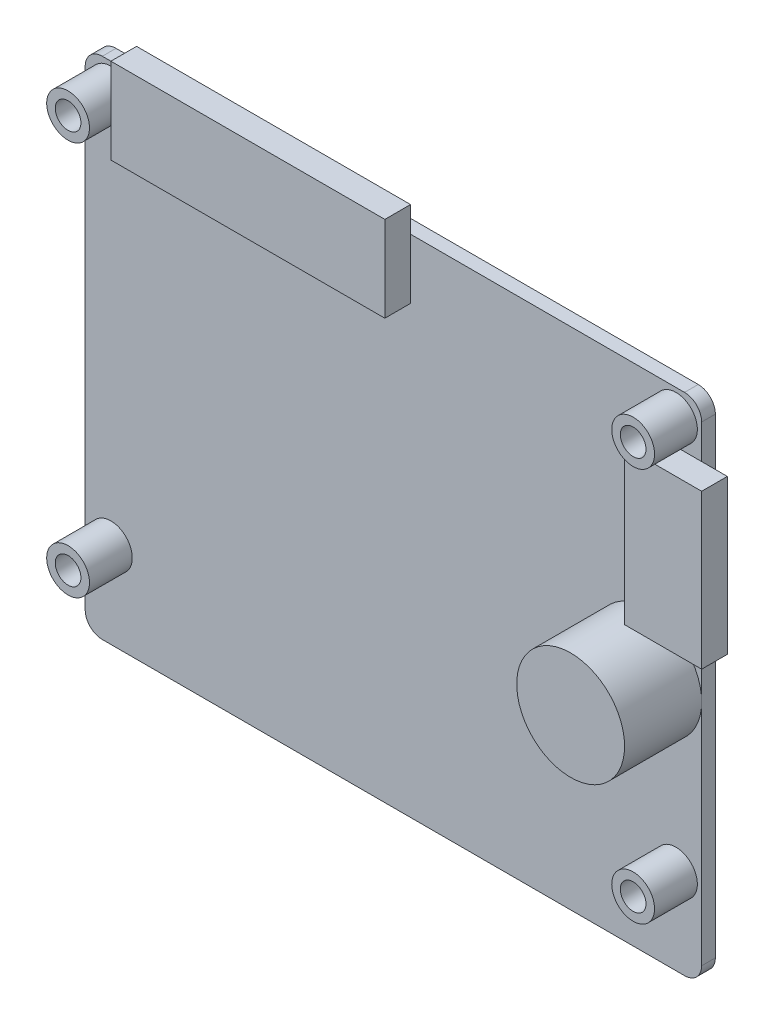
ISO-10303-21;
HEADER;
FILE_DESCRIPTION(('STEP AP214'),'2;1');
FILE_NAME('part.step','',(''),(''),'','','');
FILE_SCHEMA(('AUTOMOTIVE_DESIGN { 1 0 10303 214 1 1 1 1 }'));
ENDSEC;
DATA;
#1=APPLICATION_CONTEXT('core data for automotive mechanical design processes');
#2=APPLICATION_PROTOCOL_DEFINITION('international standard','automotive_design',2000,#1);
#3=PRODUCT_CONTEXT('',#1,'mechanical');
#4=PRODUCT('Part','Part','',(#3));
#5=PRODUCT_RELATED_PRODUCT_CATEGORY('part','',(#4));
#6=PRODUCT_DEFINITION_FORMATION('','',#4);
#7=PRODUCT_DEFINITION_CONTEXT('part definition',#1,'design');
#8=PRODUCT_DEFINITION('design','',#6,#7);
#9=PRODUCT_DEFINITION_SHAPE('','',#8);
#10=(LENGTH_UNIT() NAMED_UNIT(*) SI_UNIT(.MILLI.,.METRE.));
#11=(NAMED_UNIT(*) PLANE_ANGLE_UNIT() SI_UNIT($,.RADIAN.));
#12=(NAMED_UNIT(*) SI_UNIT($,.STERADIAN.) SOLID_ANGLE_UNIT());
#13=UNCERTAINTY_MEASURE_WITH_UNIT(LENGTH_MEASURE(1.E-05),#10,'distance_accuracy_value','');
#14=(GEOMETRIC_REPRESENTATION_CONTEXT(3) GLOBAL_UNCERTAINTY_ASSIGNED_CONTEXT((#13)) GLOBAL_UNIT_ASSIGNED_CONTEXT((#10,
#11,#12)) REPRESENTATION_CONTEXT('',''));
#15=CARTESIAN_POINT('',(0.,0.,0.));
#16=DIRECTION('',(0.,0.,1.));
#17=DIRECTION('',(1.,0.,0.));
#18=AXIS2_PLACEMENT_3D('',#15,#16,#17);
#19=CARTESIAN_POINT('',(-34.,27.5,0.));
#20=DIRECTION('',(0.,0.,-1.));
#21=DIRECTION('',(-1.,0.,0.));
#22=AXIS2_PLACEMENT_3D('',#19,#20,#21);
#23=PLANE('',#22);
#24=CARTESIAN_POINT('',(33.,-19.5,0.));
#25=DIRECTION('',(0.,0.,1.));
#26=DIRECTION('',(1.,0.,0.));
#27=AXIS2_PLACEMENT_3D('',#24,#25,#26);
#28=CIRCLE('',#27,1.5);
#29=CARTESIAN_POINT('',(34.5,-19.5,0.));
#30=VERTEX_POINT('',#29);
#31=EDGE_CURVE('E329',#30,#30,#28,.T.);
#32=ORIENTED_EDGE('',*,*,#31,.T.);
#33=EDGE_LOOP('',(#32));
#34=FACE_BOUND('',#33,.T.);
#35=CARTESIAN_POINT('',(-33.,26.5,0.));
#36=DIRECTION('',(0.,0.,1.));
#37=DIRECTION('',(1.,0.,0.));
#38=AXIS2_PLACEMENT_3D('',#35,#36,#37);
#39=CIRCLE('',#38,1.5);
#40=CARTESIAN_POINT('',(-31.5,26.5,0.));
#41=VERTEX_POINT('',#40);
#42=EDGE_CURVE('E335',#41,#41,#39,.T.);
#43=ORIENTED_EDGE('',*,*,#42,.T.);
#44=EDGE_LOOP('',(#43));
#45=FACE_BOUND('',#44,.T.);
#46=CARTESIAN_POINT('',(-34.,27.5,0.));
#47=DIRECTION('',(0.,0.,1.));
#48=DIRECTION('',(-1.,0.,0.));
#49=AXIS2_PLACEMENT_3D('',#46,#47,#48);
#50=CIRCLE('',#49,2.);
#51=CARTESIAN_POINT('',(-34.,29.5,0.));
#52=VERTEX_POINT('',#51);
#53=CARTESIAN_POINT('',(-36.,27.5,0.));
#54=VERTEX_POINT('',#53);
#55=EDGE_CURVE('E338',#52,#54,#50,.T.);
#56=ORIENTED_EDGE('',*,*,#55,.F.);
#57=DIRECTION('',(-1.,0.,0.));
#58=VECTOR('',#57,1.);
#59=CARTESIAN_POINT('',(-34.,29.5,0.));
#60=LINE('',#59,#58);
#61=CARTESIAN_POINT('',(34.,29.5,0.));
#62=VERTEX_POINT('',#61);
#63=EDGE_CURVE('E343',#62,#52,#60,.T.);
#64=ORIENTED_EDGE('',*,*,#63,.F.);
#65=CARTESIAN_POINT('',(34.,27.5,0.));
#66=DIRECTION('',(0.,0.,1.));
#67=DIRECTION('',(-1.,0.,0.));
#68=AXIS2_PLACEMENT_3D('',#65,#66,#67);
#69=CIRCLE('',#68,2.);
#70=CARTESIAN_POINT('',(36.,27.5,0.));
#71=VERTEX_POINT('',#70);
#72=EDGE_CURVE('E375',#71,#62,#69,.T.);
#73=ORIENTED_EDGE('',*,*,#72,.F.);
#74=DIRECTION('',(0.,1.,0.));
#75=VECTOR('',#74,1.);
#76=CARTESIAN_POINT('',(36.,-27.5,0.));
#77=LINE('',#76,#75);
#78=CARTESIAN_POINT('',(36.,-27.5,0.));
#79=VERTEX_POINT('',#78);
#80=EDGE_CURVE('E373',#79,#71,#77,.T.);
#81=ORIENTED_EDGE('',*,*,#80,.F.);
#82=CARTESIAN_POINT('',(34.,-27.5,0.));
#83=DIRECTION('',(0.,0.,1.));
#84=DIRECTION('',(1.,0.,0.));
#85=AXIS2_PLACEMENT_3D('',#82,#83,#84);
#86=CIRCLE('',#85,2.);
#87=CARTESIAN_POINT('',(34.,-29.5,0.));
#88=VERTEX_POINT('',#87);
#89=EDGE_CURVE('E371',#88,#79,#86,.T.);
#90=ORIENTED_EDGE('',*,*,#89,.F.);
#91=DIRECTION('',(1.,0.,0.));
#92=VECTOR('',#91,1.);
#93=CARTESIAN_POINT('',(-34.,-29.5,0.));
#94=LINE('',#93,#92);
#95=CARTESIAN_POINT('',(-34.,-29.5,0.));
#96=VERTEX_POINT('',#95);
#97=EDGE_CURVE('E369',#96,#88,#94,.T.);
#98=ORIENTED_EDGE('',*,*,#97,.F.);
#99=CARTESIAN_POINT('',(-34.,-27.5,0.));
#100=DIRECTION('',(0.,0.,1.));
#101=DIRECTION('',(-1.,0.,0.));
#102=AXIS2_PLACEMENT_3D('',#99,#100,#101);
#103=CIRCLE('',#102,2.);
#104=CARTESIAN_POINT('',(-36.,-27.5,0.));
#105=VERTEX_POINT('',#104);
#106=EDGE_CURVE('E367',#105,#96,#103,.T.);
#107=ORIENTED_EDGE('',*,*,#106,.F.);
#108=DIRECTION('',(0.,-1.,0.));
#109=VECTOR('',#108,1.);
#110=CARTESIAN_POINT('',(-36.,-27.5,0.));
#111=LINE('',#110,#109);
#112=EDGE_CURVE('E365',#54,#105,#111,.T.);
#113=ORIENTED_EDGE('',*,*,#112,.F.);
#114=EDGE_LOOP('',(#56,#64,#73,#81,#90,#98,#107,#113));
#115=FACE_BOUND('',#114,.T.);
#116=CARTESIAN_POINT('',(33.,26.5,0.));
#117=DIRECTION('',(0.,0.,1.));
#118=DIRECTION('',(1.,0.,0.));
#119=AXIS2_PLACEMENT_3D('',#116,#117,#118);
#120=CIRCLE('',#119,1.5);
#121=CARTESIAN_POINT('',(34.5,26.5,0.));
#122=VERTEX_POINT('',#121);
#123=EDGE_CURVE('E332',#122,#122,#120,.T.);
#124=ORIENTED_EDGE('',*,*,#123,.T.);
#125=EDGE_LOOP('',(#124));
#126=FACE_BOUND('',#125,.T.);
#127=CARTESIAN_POINT('',(-33.,-19.5,0.));
#128=DIRECTION('',(0.,0.,1.));
#129=DIRECTION('',(1.,0.,0.));
#130=AXIS2_PLACEMENT_3D('',#127,#128,#129);
#131=CIRCLE('',#130,1.5);
#132=CARTESIAN_POINT('',(-31.5,-19.5,0.));
#133=VERTEX_POINT('',#132);
#134=EDGE_CURVE('E326',#133,#133,#131,.T.);
#135=ORIENTED_EDGE('',*,*,#134,.T.);
#136=EDGE_LOOP('',(#135));
#137=FACE_BOUND('',#136,.T.);
#138=DIRECTION('',(-1.,0.,0.));
#139=VECTOR('',#138,1.);
#140=CARTESIAN_POINT('',(26.,5.,0.));
#141=LINE('',#140,#139);
#142=CARTESIAN_POINT('',(26.,5.,0.));
#143=VERTEX_POINT('',#142);
#144=CARTESIAN_POINT('',(17.,5.,0.));
#145=VERTEX_POINT('',#144);
#146=EDGE_CURVE('E846',#143,#145,#141,.T.);
#147=ORIENTED_EDGE('',*,*,#146,.F.);
#148=DIRECTION('',(0.,-1.,0.));
#149=VECTOR('',#148,1.);
#150=CARTESIAN_POINT('',(26.,11.5,0.));
#151=LINE('',#150,#149);
#152=CARTESIAN_POINT('',(26.,11.5,0.));
#153=VERTEX_POINT('',#152);
#154=EDGE_CURVE('E220',#153,#143,#151,.T.);
#155=ORIENTED_EDGE('',*,*,#154,.F.);
#156=DIRECTION('',(1.,0.,0.));
#157=VECTOR('',#156,1.);
#158=CARTESIAN_POINT('',(26.,11.5,0.));
#159=LINE('',#158,#157);
#160=CARTESIAN_POINT('',(17.,11.5,0.));
#161=VERTEX_POINT('',#160);
#162=EDGE_CURVE('E216',#161,#153,#159,.T.);
#163=ORIENTED_EDGE('',*,*,#162,.F.);
#164=DIRECTION('',(0.,1.,0.));
#165=VECTOR('',#164,1.);
#166=CARTESIAN_POINT('',(17.,11.5,0.));
#167=LINE('',#166,#165);
#168=EDGE_CURVE('E843',#145,#161,#167,.T.);
#169=ORIENTED_EDGE('',*,*,#168,.F.);
#170=EDGE_LOOP('',(#147,#155,#163,#169));
#171=FACE_BOUND('',#170,.T.);
#172=ADVANCED_FACE('F44',(#34,#45,#115,#126,#137,#171),#23,.T.);
#173=CARTESIAN_POINT('',(-34.,27.5,1.6));
#174=DIRECTION('',(0.,0.,-1.));
#175=DIRECTION('',(-1.,0.,0.));
#176=AXIS2_PLACEMENT_3D('',#173,#174,#175);
#177=PLANE('',#176);
#178=CARTESIAN_POINT('',(-33.,-19.5,1.6));
#179=DIRECTION('',(0.,0.,-1.));
#180=DIRECTION('',(-1.,0.,0.));
#181=AXIS2_PLACEMENT_3D('',#178,#179,#180);
#182=CIRCLE('',#181,2.5);
#183=CARTESIAN_POINT('',(-35.5,-19.5,1.6));
#184=VERTEX_POINT('',#183);
#185=EDGE_CURVE('E52',#184,#184,#182,.F.);
#186=ORIENTED_EDGE('',*,*,#185,.F.);
#187=EDGE_LOOP('',(#186));
#188=FACE_BOUND('',#187,.T.);
#189=CARTESIAN_POINT('',(33.,26.5,1.6));
#190=DIRECTION('',(0.,0.,-1.));
#191=DIRECTION('',(-1.,0.,0.));
#192=AXIS2_PLACEMENT_3D('',#189,#190,#191);
#193=CIRCLE('',#192,2.5);
#194=CARTESIAN_POINT('',(30.5,26.5,1.6));
#195=VERTEX_POINT('',#194);
#196=EDGE_CURVE('E401',#195,#195,#193,.F.);
#197=ORIENTED_EDGE('',*,*,#196,.F.);
#198=EDGE_LOOP('',(#197));
#199=FACE_BOUND('',#198,.T.);
#200=CARTESIAN_POINT('',(-33.,26.5,1.6));
#201=DIRECTION('',(0.,0.,-1.));
#202=DIRECTION('',(-1.,0.,0.));
#203=AXIS2_PLACEMENT_3D('',#200,#201,#202);
#204=CIRCLE('',#203,2.5);
#205=CARTESIAN_POINT('',(-35.5,26.5,1.6));
#206=VERTEX_POINT('',#205);
#207=EDGE_CURVE('E404',#206,#206,#204,.F.);
#208=ORIENTED_EDGE('',*,*,#207,.F.);
#209=EDGE_LOOP('',(#208));
#210=FACE_BOUND('',#209,.T.);
#211=CARTESIAN_POINT('',(33.,-19.5,1.6));
#212=DIRECTION('',(0.,0.,-1.));
#213=DIRECTION('',(-1.,0.,0.));
#214=AXIS2_PLACEMENT_3D('',#211,#212,#213);
#215=CIRCLE('',#214,2.5);
#216=CARTESIAN_POINT('',(30.5,-19.5,1.6));
#217=VERTEX_POINT('',#216);
#218=EDGE_CURVE('E11',#217,#217,#215,.F.);
#219=ORIENTED_EDGE('',*,*,#218,.F.);
#220=EDGE_LOOP('',(#219));
#221=FACE_BOUND('',#220,.T.);
#222=DIRECTION('',(0.,-1.,0.));
#223=VECTOR('',#222,1.);
#224=CARTESIAN_POINT('',(-30.,29.5,1.6));
#225=LINE('',#224,#223);
#226=CARTESIAN_POINT('',(-30.,29.5,1.6));
#227=VERTEX_POINT('',#226);
#228=CARTESIAN_POINT('',(-30.,22.5,1.6));
#229=VERTEX_POINT('',#228);
#230=EDGE_CURVE('E244',#227,#229,#225,.T.);
#231=ORIENTED_EDGE('',*,*,#230,.F.);
#232=DIRECTION('',(-1.,0.,0.));
#233=VECTOR('',#232,1.);
#234=CARTESIAN_POINT('',(-34.,29.5,1.6));
#235=LINE('',#234,#233);
#236=CARTESIAN_POINT('',(-34.,29.5,1.6));
#237=VERTEX_POINT('',#236);
#238=EDGE_CURVE('E357',#227,#237,#235,.T.);
#239=ORIENTED_EDGE('',*,*,#238,.T.);
#240=CARTESIAN_POINT('',(-34.,27.5,1.6));
#241=DIRECTION('',(0.,0.,1.));
#242=DIRECTION('',(-1.,0.,0.));
#243=AXIS2_PLACEMENT_3D('',#240,#241,#242);
#244=CIRCLE('',#243,2.);
#245=CARTESIAN_POINT('',(-36.,27.5,1.6));
#246=VERTEX_POINT('',#245);
#247=EDGE_CURVE('E339',#237,#246,#244,.T.);
#248=ORIENTED_EDGE('',*,*,#247,.T.);
#249=DIRECTION('',(0.,-1.,0.));
#250=VECTOR('',#249,1.);
#251=CARTESIAN_POINT('',(-36.,-27.5,1.6));
#252=LINE('',#251,#250);
#253=CARTESIAN_POINT('',(-36.,-27.5,1.6));
#254=VERTEX_POINT('',#253);
#255=EDGE_CURVE('E342',#246,#254,#252,.T.);
#256=ORIENTED_EDGE('',*,*,#255,.T.);
#257=CARTESIAN_POINT('',(-34.,-27.5,1.6));
#258=DIRECTION('',(0.,0.,1.));
#259=DIRECTION('',(-1.,0.,0.));
#260=AXIS2_PLACEMENT_3D('',#257,#258,#259);
#261=CIRCLE('',#260,2.);
#262=CARTESIAN_POINT('',(-34.,-29.5,1.6));
#263=VERTEX_POINT('',#262);
#264=EDGE_CURVE('E345',#254,#263,#261,.T.);
#265=ORIENTED_EDGE('',*,*,#264,.T.);
#266=DIRECTION('',(1.,0.,0.));
#267=VECTOR('',#266,1.);
#268=CARTESIAN_POINT('',(-34.,-29.5,1.6));
#269=LINE('',#268,#267);
#270=CARTESIAN_POINT('',(34.,-29.5,1.6));
#271=VERTEX_POINT('',#270);
#272=EDGE_CURVE('E347',#263,#271,#269,.T.);
#273=ORIENTED_EDGE('',*,*,#272,.T.);
#274=CARTESIAN_POINT('',(34.,-27.5,1.6));
#275=DIRECTION('',(0.,0.,1.));
#276=DIRECTION('',(1.,0.,0.));
#277=AXIS2_PLACEMENT_3D('',#274,#275,#276);
#278=CIRCLE('',#277,2.);
#279=CARTESIAN_POINT('',(36.,-27.5,1.6));
#280=VERTEX_POINT('',#279);
#281=EDGE_CURVE('E349',#271,#280,#278,.T.);
#282=ORIENTED_EDGE('',*,*,#281,.T.);
#283=DIRECTION('',(0.,1.,0.));
#284=VECTOR('',#283,1.);
#285=CARTESIAN_POINT('',(36.,-27.5,1.6));
#286=LINE('',#285,#284);
#287=CARTESIAN_POINT('',(36.,-0.800000000000002,1.6));
#288=VERTEX_POINT('',#287);
#289=EDGE_CURVE('E352',#280,#288,#286,.T.);
#290=ORIENTED_EDGE('',*,*,#289,.T.);
#291=CARTESIAN_POINT('',(29.7,-0.800000000000002,1.6));
#292=DIRECTION('',(0.,0.,1.));
#293=DIRECTION('',(1.,0.,0.));
#294=AXIS2_PLACEMENT_3D('',#291,#292,#293);
#295=CIRCLE('',#294,6.3);
#296=EDGE_CURVE('E296',#288,#288,#295,.T.);
#297=ORIENTED_EDGE('',*,*,#296,.F.);
#298=CARTESIAN_POINT('',(36.,5.50000000000001,1.6));
#299=VERTEX_POINT('',#298);
#300=EDGE_CURVE('E355',#288,#299,#286,.T.);
#301=ORIENTED_EDGE('',*,*,#300,.T.);
#302=DIRECTION('',(1.,0.,0.));
#303=VECTOR('',#302,1.);
#304=CARTESIAN_POINT('',(36.,5.5,1.6));
#305=LINE('',#304,#303);
#306=CARTESIAN_POINT('',(30.,5.5,1.6));
#307=VERTEX_POINT('',#306);
#308=EDGE_CURVE('E265',#307,#299,#305,.T.);
#309=ORIENTED_EDGE('',*,*,#308,.F.);
#310=DIRECTION('',(0.,-1.,0.));
#311=VECTOR('',#310,1.);
#312=CARTESIAN_POINT('',(30.,5.5,1.6));
#313=LINE('',#312,#311);
#314=CARTESIAN_POINT('',(30.,23.5,1.6));
#315=VERTEX_POINT('',#314);
#316=EDGE_CURVE('E279',#315,#307,#313,.T.);
#317=ORIENTED_EDGE('',*,*,#316,.F.);
#318=DIRECTION('',(-1.,0.,0.));
#319=VECTOR('',#318,1.);
#320=CARTESIAN_POINT('',(36.,23.5,1.6));
#321=LINE('',#320,#319);
#322=CARTESIAN_POINT('',(36.,23.5,1.6));
#323=VERTEX_POINT('',#322);
#324=EDGE_CURVE('E275',#323,#315,#321,.T.);
#325=ORIENTED_EDGE('',*,*,#324,.F.);
#326=CARTESIAN_POINT('',(36.,27.5,1.6));
#327=VERTEX_POINT('',#326);
#328=EDGE_CURVE('E351',#323,#327,#286,.T.);
#329=ORIENTED_EDGE('',*,*,#328,.T.);
#330=CARTESIAN_POINT('',(34.,27.5,1.6));
#331=DIRECTION('',(0.,0.,1.));
#332=DIRECTION('',(-1.,0.,0.));
#333=AXIS2_PLACEMENT_3D('',#330,#331,#332);
#334=CIRCLE('',#333,2.);
#335=CARTESIAN_POINT('',(34.,29.5,1.6));
#336=VERTEX_POINT('',#335);
#337=EDGE_CURVE('E354',#327,#336,#334,.T.);
#338=ORIENTED_EDGE('',*,*,#337,.T.);
#339=CARTESIAN_POINT('',(2.00000000000002,29.5,1.6));
#340=VERTEX_POINT('',#339);
#341=EDGE_CURVE('E358',#336,#340,#235,.T.);
#342=ORIENTED_EDGE('',*,*,#341,.T.);
#343=DIRECTION('',(0.,1.,0.));
#344=VECTOR('',#343,1.);
#345=CARTESIAN_POINT('',(2.00000000000002,29.5,1.6));
#346=LINE('',#345,#344);
#347=CARTESIAN_POINT('',(2.00000000000002,22.5,1.6));
#348=VERTEX_POINT('',#347);
#349=EDGE_CURVE('E239',#348,#340,#346,.T.);
#350=ORIENTED_EDGE('',*,*,#349,.F.);
#351=DIRECTION('',(1.,0.,0.));
#352=VECTOR('',#351,1.);
#353=CARTESIAN_POINT('',(2.00000000000002,22.5,1.6));
#354=LINE('',#353,#352);
#355=EDGE_CURVE('E67',#229,#348,#354,.T.);
#356=ORIENTED_EDGE('',*,*,#355,.F.);
#357=EDGE_LOOP('',(#231,#239,#248,#256,#265,#273,#282,#290,#297,#301,#309,#317,#325,#329,#338,
#342,#350,#356));
#358=FACE_BOUND('',#357,.T.);
#359=ADVANCED_FACE('F411',(#188,#199,#210,#221,#358),#177,.F.);
#360=CARTESIAN_POINT('',(-34.,27.5,1.6));
#361=DIRECTION('',(0.,0.,-1.));
#362=DIRECTION('',(-1.,0.,0.));
#363=AXIS2_PLACEMENT_3D('',#360,#361,#362);
#364=CYLINDRICAL_SURFACE('',#363,2.);
#365=ORIENTED_EDGE('',*,*,#55,.T.);
#366=DIRECTION('',(0.,0.,-1.));
#367=VECTOR('',#366,1.);
#368=CARTESIAN_POINT('',(-36.,27.5,1.6));
#369=LINE('',#368,#367);
#370=EDGE_CURVE('E398',#246,#54,#369,.T.);
#371=ORIENTED_EDGE('',*,*,#370,.F.);
#372=ORIENTED_EDGE('',*,*,#247,.F.);
#373=DIRECTION('',(0.,0.,-1.));
#374=VECTOR('',#373,1.);
#375=CARTESIAN_POINT('',(-34.,29.5,1.6));
#376=LINE('',#375,#374);
#377=EDGE_CURVE('E361',#237,#52,#376,.T.);
#378=ORIENTED_EDGE('',*,*,#377,.T.);
#379=EDGE_LOOP('',(#365,#371,#372,#378));
#380=FACE_BOUND('',#379,.T.);
#381=ADVANCED_FACE('F46',(#380),#364,.T.);
#382=CARTESIAN_POINT('',(-36.,-27.5,1.6));
#383=DIRECTION('',(1.,0.,0.));
#384=DIRECTION('',(0.,0.,-1.));
#385=AXIS2_PLACEMENT_3D('',#382,#383,#384);
#386=PLANE('',#385);
#387=ORIENTED_EDGE('',*,*,#112,.T.);
#388=DIRECTION('',(0.,0.,-1.));
#389=VECTOR('',#388,1.);
#390=CARTESIAN_POINT('',(-36.,-27.5,1.6));
#391=LINE('',#390,#389);
#392=EDGE_CURVE('E395',#254,#105,#391,.T.);
#393=ORIENTED_EDGE('',*,*,#392,.F.);
#394=ORIENTED_EDGE('',*,*,#255,.F.);
#395=ORIENTED_EDGE('',*,*,#370,.T.);
#396=EDGE_LOOP('',(#387,#393,#394,#395));
#397=FACE_BOUND('',#396,.T.);
#398=ADVANCED_FACE('F484',(#397),#386,.F.);
#399=CARTESIAN_POINT('',(-34.,-27.5,1.6));
#400=DIRECTION('',(0.,0.,-1.));
#401=DIRECTION('',(-1.,0.,0.));
#402=AXIS2_PLACEMENT_3D('',#399,#400,#401);
#403=CYLINDRICAL_SURFACE('',#402,2.);
#404=ORIENTED_EDGE('',*,*,#106,.T.);
#405=DIRECTION('',(0.,0.,-1.));
#406=VECTOR('',#405,1.);
#407=CARTESIAN_POINT('',(-34.,-29.5,1.6));
#408=LINE('',#407,#406);
#409=EDGE_CURVE('E392',#263,#96,#408,.T.);
#410=ORIENTED_EDGE('',*,*,#409,.F.);
#411=ORIENTED_EDGE('',*,*,#264,.F.);
#412=ORIENTED_EDGE('',*,*,#392,.T.);
#413=EDGE_LOOP('',(#404,#410,#411,#412));
#414=FACE_BOUND('',#413,.T.);
#415=ADVANCED_FACE('F481',(#414),#403,.T.);
#416=CARTESIAN_POINT('',(-34.,-29.5,1.6));
#417=DIRECTION('',(0.,1.,0.));
#418=DIRECTION('',(0.,0.,1.));
#419=AXIS2_PLACEMENT_3D('',#416,#417,#418);
#420=PLANE('',#419);
#421=ORIENTED_EDGE('',*,*,#97,.T.);
#422=DIRECTION('',(0.,0.,-1.));
#423=VECTOR('',#422,1.);
#424=CARTESIAN_POINT('',(34.,-29.5,1.6));
#425=LINE('',#424,#423);
#426=EDGE_CURVE('E389',#271,#88,#425,.T.);
#427=ORIENTED_EDGE('',*,*,#426,.F.);
#428=ORIENTED_EDGE('',*,*,#272,.F.);
#429=ORIENTED_EDGE('',*,*,#409,.T.);
#430=EDGE_LOOP('',(#421,#427,#428,#429));
#431=FACE_BOUND('',#430,.T.);
#432=ADVANCED_FACE('F477',(#431),#420,.F.);
#433=CARTESIAN_POINT('',(34.,-27.5,1.6));
#434=DIRECTION('',(0.,0.,-1.));
#435=DIRECTION('',(-1.,0.,0.));
#436=AXIS2_PLACEMENT_3D('',#433,#434,#435);
#437=CYLINDRICAL_SURFACE('',#436,2.);
#438=ORIENTED_EDGE('',*,*,#89,.T.);
#439=DIRECTION('',(0.,0.,-1.));
#440=VECTOR('',#439,1.);
#441=CARTESIAN_POINT('',(36.,-27.5,1.6));
#442=LINE('',#441,#440);
#443=EDGE_CURVE('E386',#280,#79,#442,.T.);
#444=ORIENTED_EDGE('',*,*,#443,.F.);
#445=ORIENTED_EDGE('',*,*,#281,.F.);
#446=ORIENTED_EDGE('',*,*,#426,.T.);
#447=EDGE_LOOP('',(#438,#444,#445,#446));
#448=FACE_BOUND('',#447,.T.);
#449=ADVANCED_FACE('F473',(#448),#437,.T.);
#450=CARTESIAN_POINT('',(36.,-27.5,1.6));
#451=DIRECTION('',(-1.,0.,0.));
#452=DIRECTION('',(0.,0.,1.));
#453=AXIS2_PLACEMENT_3D('',#450,#451,#452);
#454=PLANE('',#453);
#455=ORIENTED_EDGE('',*,*,#80,.T.);
#456=DIRECTION('',(0.,0.,-1.));
#457=VECTOR('',#456,1.);
#458=CARTESIAN_POINT('',(36.,27.5,1.6));
#459=LINE('',#458,#457);
#460=EDGE_CURVE('E383',#327,#71,#459,.T.);
#461=ORIENTED_EDGE('',*,*,#460,.F.);
#462=ORIENTED_EDGE('',*,*,#328,.F.);
#463=EDGE_CURVE('E519',#299,#323,#286,.T.);
#464=ORIENTED_EDGE('',*,*,#463,.F.);
#465=ORIENTED_EDGE('',*,*,#300,.F.);
#466=ORIENTED_EDGE('',*,*,#289,.F.);
#467=ORIENTED_EDGE('',*,*,#443,.T.);
#468=EDGE_LOOP('',(#455,#461,#462,#464,#465,#466,#467));
#469=FACE_BOUND('',#468,.T.);
#470=ADVANCED_FACE('F469',(#469),#454,.F.);
#471=CARTESIAN_POINT('',(34.,27.5,1.6));
#472=DIRECTION('',(0.,0.,-1.));
#473=DIRECTION('',(-1.,0.,0.));
#474=AXIS2_PLACEMENT_3D('',#471,#472,#473);
#475=CYLINDRICAL_SURFACE('',#474,2.);
#476=ORIENTED_EDGE('',*,*,#72,.T.);
#477=DIRECTION('',(0.,0.,-1.));
#478=VECTOR('',#477,1.);
#479=CARTESIAN_POINT('',(34.,29.5,1.6));
#480=LINE('',#479,#478);
#481=EDGE_CURVE('E380',#336,#62,#480,.T.);
#482=ORIENTED_EDGE('',*,*,#481,.F.);
#483=ORIENTED_EDGE('',*,*,#337,.F.);
#484=ORIENTED_EDGE('',*,*,#460,.T.);
#485=EDGE_LOOP('',(#476,#482,#483,#484));
#486=FACE_BOUND('',#485,.T.);
#487=ADVANCED_FACE('F466',(#486),#475,.T.);
#488=CARTESIAN_POINT('',(-34.,29.5,1.6));
#489=DIRECTION('',(0.,-1.,0.));
#490=DIRECTION('',(0.,0.,-1.));
#491=AXIS2_PLACEMENT_3D('',#488,#489,#490);
#492=PLANE('',#491);
#493=ORIENTED_EDGE('',*,*,#63,.T.);
#494=ORIENTED_EDGE('',*,*,#377,.F.);
#495=ORIENTED_EDGE('',*,*,#238,.F.);
#496=EDGE_CURVE('E362',#340,#227,#235,.T.);
#497=ORIENTED_EDGE('',*,*,#496,.F.);
#498=ORIENTED_EDGE('',*,*,#341,.F.);
#499=ORIENTED_EDGE('',*,*,#481,.T.);
#500=EDGE_LOOP('',(#493,#494,#495,#497,#498,#499));
#501=FACE_BOUND('',#500,.T.);
#502=ADVANCED_FACE('F462',(#501),#492,.F.);
#503=CARTESIAN_POINT('',(-33.,26.5,1.6));
#504=DIRECTION('',(0.,0.,-1.));
#505=DIRECTION('',(-1.,0.,0.));
#506=AXIS2_PLACEMENT_3D('',#503,#504,#505);
#507=CYLINDRICAL_SURFACE('',#506,1.5);
#508=ORIENTED_EDGE('',*,*,#42,.F.);
#509=EDGE_LOOP('',(#508));
#510=FACE_BOUND('',#509,.T.);
#511=CARTESIAN_POINT('',(-33.,26.5,6.6));
#512=DIRECTION('',(0.,0.,1.));
#513=DIRECTION('',(1.,0.,0.));
#514=AXIS2_PLACEMENT_3D('',#511,#512,#513);
#515=CIRCLE('',#514,1.5);
#516=CARTESIAN_POINT('',(-31.5,26.5,6.6));
#517=VERTEX_POINT('',#516);
#518=EDGE_CURVE('E317',#517,#517,#515,.T.);
#519=ORIENTED_EDGE('',*,*,#518,.T.);
#520=EDGE_LOOP('',(#519));
#521=FACE_BOUND('',#520,.T.);
#522=ADVANCED_FACE('F465',(#510,#521),#507,.F.);
#523=CARTESIAN_POINT('',(33.,26.5,1.6));
#524=DIRECTION('',(0.,0.,-1.));
#525=DIRECTION('',(-1.,0.,0.));
#526=AXIS2_PLACEMENT_3D('',#523,#524,#525);
#527=CYLINDRICAL_SURFACE('',#526,1.5);
#528=ORIENTED_EDGE('',*,*,#123,.F.);
#529=EDGE_LOOP('',(#528));
#530=FACE_BOUND('',#529,.T.);
#531=CARTESIAN_POINT('',(33.,26.5,6.6));
#532=DIRECTION('',(0.,0.,1.));
#533=DIRECTION('',(1.,0.,0.));
#534=AXIS2_PLACEMENT_3D('',#531,#532,#533);
#535=CIRCLE('',#534,1.5);
#536=CARTESIAN_POINT('',(34.5,26.5,6.6));
#537=VERTEX_POINT('',#536);
#538=EDGE_CURVE('E320',#537,#537,#535,.T.);
#539=ORIENTED_EDGE('',*,*,#538,.T.);
#540=EDGE_LOOP('',(#539));
#541=FACE_BOUND('',#540,.T.);
#542=ADVANCED_FACE('F574',(#530,#541),#527,.F.);
#543=CARTESIAN_POINT('',(33.,-19.5,1.6));
#544=DIRECTION('',(0.,0.,-1.));
#545=DIRECTION('',(-1.,0.,0.));
#546=AXIS2_PLACEMENT_3D('',#543,#544,#545);
#547=CYLINDRICAL_SURFACE('',#546,1.5);
#548=ORIENTED_EDGE('',*,*,#31,.F.);
#549=EDGE_LOOP('',(#548));
#550=FACE_BOUND('',#549,.T.);
#551=CARTESIAN_POINT('',(33.,-19.5,6.6));
#552=DIRECTION('',(0.,0.,1.));
#553=DIRECTION('',(1.,0.,0.));
#554=AXIS2_PLACEMENT_3D('',#551,#552,#553);
#555=CIRCLE('',#554,1.5);
#556=CARTESIAN_POINT('',(34.5,-19.5,6.6));
#557=VERTEX_POINT('',#556);
#558=EDGE_CURVE('E305',#557,#557,#555,.T.);
#559=ORIENTED_EDGE('',*,*,#558,.T.);
#560=EDGE_LOOP('',(#559));
#561=FACE_BOUND('',#560,.T.);
#562=ADVANCED_FACE('F570',(#550,#561),#547,.F.);
#563=CARTESIAN_POINT('',(-33.,-19.5,1.6));
#564=DIRECTION('',(0.,0.,-1.));
#565=DIRECTION('',(-1.,0.,0.));
#566=AXIS2_PLACEMENT_3D('',#563,#564,#565);
#567=CYLINDRICAL_SURFACE('',#566,1.5);
#568=ORIENTED_EDGE('',*,*,#134,.F.);
#569=EDGE_LOOP('',(#568));
#570=FACE_BOUND('',#569,.T.);
#571=CARTESIAN_POINT('',(-33.,-19.5,6.6));
#572=DIRECTION('',(0.,0.,1.));
#573=DIRECTION('',(1.,0.,0.));
#574=AXIS2_PLACEMENT_3D('',#571,#572,#573);
#575=CIRCLE('',#574,1.5);
#576=CARTESIAN_POINT('',(-31.5,-19.5,6.6));
#577=VERTEX_POINT('',#576);
#578=EDGE_CURVE('E311',#577,#577,#575,.T.);
#579=ORIENTED_EDGE('',*,*,#578,.T.);
#580=EDGE_LOOP('',(#579));
#581=FACE_BOUND('',#580,.T.);
#582=ADVANCED_FACE('F563',(#570,#581),#567,.F.);
#583=CARTESIAN_POINT('',(33.,26.5,6.6));
#584=DIRECTION('',(0.,0.,1.));
#585=DIRECTION('',(1.,0.,0.));
#586=AXIS2_PLACEMENT_3D('',#583,#584,#585);
#587=PLANE('',#586);
#588=CARTESIAN_POINT('',(33.,26.5,6.6));
#589=DIRECTION('',(0.,0.,1.));
#590=DIRECTION('',(1.,0.,0.));
#591=AXIS2_PLACEMENT_3D('',#588,#589,#590);
#592=CIRCLE('',#591,2.5);
#593=CARTESIAN_POINT('',(35.5,26.5,6.6));
#594=VERTEX_POINT('',#593);
#595=EDGE_CURVE('E323',#594,#594,#592,.T.);
#596=ORIENTED_EDGE('',*,*,#595,.T.);
#597=EDGE_LOOP('',(#596));
#598=FACE_BOUND('',#597,.T.);
#599=ORIENTED_EDGE('',*,*,#538,.F.);
#600=EDGE_LOOP('',(#599));
#601=FACE_BOUND('',#600,.T.);
#602=ADVANCED_FACE('F560',(#598,#601),#587,.T.);
#603=CARTESIAN_POINT('',(33.,26.5,6.6));
#604=DIRECTION('',(0.,0.,-1.));
#605=DIRECTION('',(-1.,0.,0.));
#606=AXIS2_PLACEMENT_3D('',#603,#604,#605);
#607=CYLINDRICAL_SURFACE('',#606,2.5);
#608=ORIENTED_EDGE('',*,*,#595,.F.);
#609=EDGE_LOOP('',(#608));
#610=FACE_BOUND('',#609,.T.);
#611=ORIENTED_EDGE('',*,*,#196,.T.);
#612=EDGE_LOOP('',(#611));
#613=FACE_BOUND('',#612,.T.);
#614=ADVANCED_FACE('F558',(#610,#613),#607,.T.);
#615=CARTESIAN_POINT('',(-33.,26.5,6.6));
#616=DIRECTION('',(0.,0.,1.));
#617=DIRECTION('',(1.,0.,0.));
#618=AXIS2_PLACEMENT_3D('',#615,#616,#617);
#619=PLANE('',#618);
#620=CARTESIAN_POINT('',(-33.,26.5,6.6));
#621=DIRECTION('',(0.,0.,1.));
#622=DIRECTION('',(1.,0.,0.));
#623=AXIS2_PLACEMENT_3D('',#620,#621,#622);
#624=CIRCLE('',#623,2.5);
#625=CARTESIAN_POINT('',(-30.5,26.5,6.6));
#626=VERTEX_POINT('',#625);
#627=EDGE_CURVE('E314',#626,#626,#624,.T.);
#628=ORIENTED_EDGE('',*,*,#627,.T.);
#629=EDGE_LOOP('',(#628));
#630=FACE_BOUND('',#629,.T.);
#631=ORIENTED_EDGE('',*,*,#518,.F.);
#632=EDGE_LOOP('',(#631));
#633=FACE_BOUND('',#632,.T.);
#634=ADVANCED_FACE('F554',(#630,#633),#619,.T.);
#635=CARTESIAN_POINT('',(-33.,26.5,6.6));
#636=DIRECTION('',(0.,0.,-1.));
#637=DIRECTION('',(-1.,0.,0.));
#638=AXIS2_PLACEMENT_3D('',#635,#636,#637);
#639=CYLINDRICAL_SURFACE('',#638,2.5);
#640=ORIENTED_EDGE('',*,*,#627,.F.);
#641=EDGE_LOOP('',(#640));
#642=FACE_BOUND('',#641,.T.);
#643=ORIENTED_EDGE('',*,*,#207,.T.);
#644=EDGE_LOOP('',(#643));
#645=FACE_BOUND('',#644,.T.);
#646=ADVANCED_FACE('F550',(#642,#645),#639,.T.);
#647=CARTESIAN_POINT('',(-33.,-19.5,6.6));
#648=DIRECTION('',(0.,0.,1.));
#649=DIRECTION('',(1.,0.,0.));
#650=AXIS2_PLACEMENT_3D('',#647,#648,#649);
#651=PLANE('',#650);
#652=CARTESIAN_POINT('',(-33.,-19.5,6.6));
#653=DIRECTION('',(0.,0.,1.));
#654=DIRECTION('',(1.,0.,0.));
#655=AXIS2_PLACEMENT_3D('',#652,#653,#654);
#656=CIRCLE('',#655,2.5);
#657=CARTESIAN_POINT('',(-30.5,-19.5,6.6));
#658=VERTEX_POINT('',#657);
#659=EDGE_CURVE('E308',#658,#658,#656,.T.);
#660=ORIENTED_EDGE('',*,*,#659,.T.);
#661=EDGE_LOOP('',(#660));
#662=FACE_BOUND('',#661,.T.);
#663=ORIENTED_EDGE('',*,*,#578,.F.);
#664=EDGE_LOOP('',(#663));
#665=FACE_BOUND('',#664,.T.);
#666=ADVANCED_FACE('F546',(#662,#665),#651,.T.);
#667=CARTESIAN_POINT('',(-33.,-19.5,6.6));
#668=DIRECTION('',(0.,0.,-1.));
#669=DIRECTION('',(-1.,0.,0.));
#670=AXIS2_PLACEMENT_3D('',#667,#668,#669);
#671=CYLINDRICAL_SURFACE('',#670,2.5);
#672=ORIENTED_EDGE('',*,*,#659,.F.);
#673=EDGE_LOOP('',(#672));
#674=FACE_BOUND('',#673,.T.);
#675=ORIENTED_EDGE('',*,*,#185,.T.);
#676=EDGE_LOOP('',(#675));
#677=FACE_BOUND('',#676,.T.);
#678=ADVANCED_FACE('F409',(#674,#677),#671,.T.);
#679=CARTESIAN_POINT('',(33.,-19.5,6.6));
#680=DIRECTION('',(0.,0.,1.));
#681=DIRECTION('',(1.,0.,0.));
#682=AXIS2_PLACEMENT_3D('',#679,#680,#681);
#683=PLANE('',#682);
#684=CARTESIAN_POINT('',(33.,-19.5,6.6));
#685=DIRECTION('',(0.,0.,1.));
#686=DIRECTION('',(1.,0.,0.));
#687=AXIS2_PLACEMENT_3D('',#684,#685,#686);
#688=CIRCLE('',#687,2.5);
#689=CARTESIAN_POINT('',(35.5,-19.5,6.6));
#690=VERTEX_POINT('',#689);
#691=EDGE_CURVE('E300',#690,#690,#688,.T.);
#692=ORIENTED_EDGE('',*,*,#691,.T.);
#693=EDGE_LOOP('',(#692));
#694=FACE_BOUND('',#693,.T.);
#695=ORIENTED_EDGE('',*,*,#558,.F.);
#696=EDGE_LOOP('',(#695));
#697=FACE_BOUND('',#696,.T.);
#698=ADVANCED_FACE('F535',(#694,#697),#683,.T.);
#699=CARTESIAN_POINT('',(33.,-19.5,6.6));
#700=DIRECTION('',(0.,0.,-1.));
#701=DIRECTION('',(-1.,0.,0.));
#702=AXIS2_PLACEMENT_3D('',#699,#700,#701);
#703=CYLINDRICAL_SURFACE('',#702,2.5);
#704=ORIENTED_EDGE('',*,*,#691,.F.);
#705=EDGE_LOOP('',(#704));
#706=FACE_BOUND('',#705,.T.);
#707=ORIENTED_EDGE('',*,*,#218,.T.);
#708=EDGE_LOOP('',(#707));
#709=FACE_BOUND('',#708,.T.);
#710=ADVANCED_FACE('F525',(#706,#709),#703,.T.);
#711=CARTESIAN_POINT('',(29.7,-0.800000000000002,10.6));
#712=DIRECTION('',(0.,0.,-1.));
#713=DIRECTION('',(-1.,0.,0.));
#714=AXIS2_PLACEMENT_3D('',#711,#712,#713);
#715=CYLINDRICAL_SURFACE('',#714,6.3);
#716=CARTESIAN_POINT('',(29.7,-0.800000000000002,10.6));
#717=DIRECTION('',(0.,0.,1.));
#718=DIRECTION('',(1.,0.,0.));
#719=AXIS2_PLACEMENT_3D('',#716,#717,#718);
#720=CIRCLE('',#719,6.3);
#721=CARTESIAN_POINT('',(36.,-0.800000000000002,10.6));
#722=VERTEX_POINT('',#721);
#723=EDGE_CURVE('E297',#722,#722,#720,.T.);
#724=ORIENTED_EDGE('',*,*,#723,.F.);
#725=EDGE_LOOP('',(#724));
#726=FACE_BOUND('',#725,.T.);
#727=ORIENTED_EDGE('',*,*,#296,.T.);
#728=EDGE_LOOP('',(#727));
#729=FACE_BOUND('',#728,.T.);
#730=ADVANCED_FACE('F522',(#726,#729),#715,.T.);
#731=CARTESIAN_POINT('',(29.7,-0.800000000000002,10.6));
#732=DIRECTION('',(0.,0.,1.));
#733=DIRECTION('',(1.,0.,0.));
#734=AXIS2_PLACEMENT_3D('',#731,#732,#733);
#735=PLANE('',#734);
#736=ORIENTED_EDGE('',*,*,#723,.T.);
#737=EDGE_LOOP('',(#736));
#738=FACE_BOUND('',#737,.T.);
#739=ADVANCED_FACE('F524',(#738),#735,.T.);
#740=CARTESIAN_POINT('',(0.,0.,1.6));
#741=DIRECTION('',(0.,0.,-1.));
#742=DIRECTION('',(-1.,0.,0.));
#743=AXIS2_PLACEMENT_3D('',#740,#741,#742);
#744=PLANE('',#743);
#745=ORIENTED_EDGE('',*,*,#463,.T.);
#746=CARTESIAN_POINT('',(39.,23.5,1.6));
#747=VERTEX_POINT('',#746);
#748=EDGE_CURVE('E276',#747,#323,#321,.T.);
#749=ORIENTED_EDGE('',*,*,#748,.F.);
#750=DIRECTION('',(0.,1.,0.));
#751=VECTOR('',#750,1.);
#752=CARTESIAN_POINT('',(39.,23.5,1.6));
#753=LINE('',#752,#751);
#754=CARTESIAN_POINT('',(39.,5.5,1.6));
#755=VERTEX_POINT('',#754);
#756=EDGE_CURVE('E251',#755,#747,#753,.T.);
#757=ORIENTED_EDGE('',*,*,#756,.F.);
#758=EDGE_CURVE('E282',#299,#755,#305,.T.);
#759=ORIENTED_EDGE('',*,*,#758,.F.);
#760=EDGE_LOOP('',(#745,#749,#757,#759));
#761=FACE_BOUND('',#760,.T.);
#762=ADVANCED_FACE('F532',(#761),#744,.T.);
#763=CARTESIAN_POINT('',(39.,23.5,4.6));
#764=DIRECTION('',(-1.,0.,0.));
#765=DIRECTION('',(0.,0.,1.));
#766=AXIS2_PLACEMENT_3D('',#763,#764,#765);
#767=PLANE('',#766);
#768=ORIENTED_EDGE('',*,*,#756,.T.);
#769=DIRECTION('',(0.,0.,-1.));
#770=VECTOR('',#769,1.);
#771=CARTESIAN_POINT('',(39.,23.5,4.6));
#772=LINE('',#771,#770);
#773=CARTESIAN_POINT('',(39.,23.5,4.6));
#774=VERTEX_POINT('',#773);
#775=EDGE_CURVE('E290',#774,#747,#772,.T.);
#776=ORIENTED_EDGE('',*,*,#775,.F.);
#777=DIRECTION('',(0.,1.,0.));
#778=VECTOR('',#777,1.);
#779=CARTESIAN_POINT('',(39.,23.5,4.6));
#780=LINE('',#779,#778);
#781=CARTESIAN_POINT('',(39.,5.5,4.6));
#782=VERTEX_POINT('',#781);
#783=EDGE_CURVE('E264',#782,#774,#780,.T.);
#784=ORIENTED_EDGE('',*,*,#783,.F.);
#785=DIRECTION('',(0.,0.,-1.));
#786=VECTOR('',#785,1.);
#787=CARTESIAN_POINT('',(39.,5.5,4.6));
#788=LINE('',#787,#786);
#789=EDGE_CURVE('E293',#782,#755,#788,.T.);
#790=ORIENTED_EDGE('',*,*,#789,.T.);
#791=EDGE_LOOP('',(#768,#776,#784,#790));
#792=FACE_BOUND('',#791,.T.);
#793=ADVANCED_FACE('F677',(#792),#767,.F.);
#794=CARTESIAN_POINT('',(36.,23.5,4.6));
#795=DIRECTION('',(0.,-1.,0.));
#796=DIRECTION('',(0.,0.,-1.));
#797=AXIS2_PLACEMENT_3D('',#794,#795,#796);
#798=PLANE('',#797);
#799=ORIENTED_EDGE('',*,*,#748,.T.);
#800=ORIENTED_EDGE('',*,*,#324,.T.);
#801=DIRECTION('',(0.,0.,-1.));
#802=VECTOR('',#801,1.);
#803=CARTESIAN_POINT('',(30.,23.5,4.6));
#804=LINE('',#803,#802);
#805=CARTESIAN_POINT('',(30.,23.5,4.6));
#806=VERTEX_POINT('',#805);
#807=EDGE_CURVE('E287',#806,#315,#804,.T.);
#808=ORIENTED_EDGE('',*,*,#807,.F.);
#809=DIRECTION('',(-1.,0.,0.));
#810=VECTOR('',#809,1.);
#811=CARTESIAN_POINT('',(36.,23.5,4.6));
#812=LINE('',#811,#810);
#813=EDGE_CURVE('E267',#774,#806,#812,.T.);
#814=ORIENTED_EDGE('',*,*,#813,.F.);
#815=ORIENTED_EDGE('',*,*,#775,.T.);
#816=EDGE_LOOP('',(#799,#800,#808,#814,#815));
#817=FACE_BOUND('',#816,.T.);
#818=ADVANCED_FACE('F688',(#817),#798,.F.);
#819=CARTESIAN_POINT('',(30.,5.5,4.6));
#820=DIRECTION('',(1.,0.,0.));
#821=DIRECTION('',(0.,0.,-1.));
#822=AXIS2_PLACEMENT_3D('',#819,#820,#821);
#823=PLANE('',#822);
#824=ORIENTED_EDGE('',*,*,#316,.T.);
#825=DIRECTION('',(0.,0.,-1.));
#826=VECTOR('',#825,1.);
#827=CARTESIAN_POINT('',(30.,5.5,4.6));
#828=LINE('',#827,#826);
#829=CARTESIAN_POINT('',(30.,5.5,4.6));
#830=VERTEX_POINT('',#829);
#831=EDGE_CURVE('E272',#830,#307,#828,.T.);
#832=ORIENTED_EDGE('',*,*,#831,.F.);
#833=DIRECTION('',(0.,-1.,0.));
#834=VECTOR('',#833,1.);
#835=CARTESIAN_POINT('',(30.,5.5,4.6));
#836=LINE('',#835,#834);
#837=EDGE_CURVE('E269',#806,#830,#836,.T.);
#838=ORIENTED_EDGE('',*,*,#837,.F.);
#839=ORIENTED_EDGE('',*,*,#807,.T.);
#840=EDGE_LOOP('',(#824,#832,#838,#839));
#841=FACE_BOUND('',#840,.T.);
#842=ADVANCED_FACE('F699',(#841),#823,.F.);
#843=CARTESIAN_POINT('',(36.,5.5,4.6));
#844=DIRECTION('',(0.,1.,0.));
#845=DIRECTION('',(0.,0.,1.));
#846=AXIS2_PLACEMENT_3D('',#843,#844,#845);
#847=PLANE('',#846);
#848=ORIENTED_EDGE('',*,*,#308,.T.);
#849=ORIENTED_EDGE('',*,*,#758,.T.);
#850=ORIENTED_EDGE('',*,*,#789,.F.);
#851=DIRECTION('',(1.,0.,0.));
#852=VECTOR('',#851,1.);
#853=CARTESIAN_POINT('',(36.,5.5,4.6));
#854=LINE('',#853,#852);
#855=EDGE_CURVE('E261',#830,#782,#854,.T.);
#856=ORIENTED_EDGE('',*,*,#855,.F.);
#857=ORIENTED_EDGE('',*,*,#831,.T.);
#858=EDGE_LOOP('',(#848,#849,#850,#856,#857));
#859=FACE_BOUND('',#858,.T.);
#860=ADVANCED_FACE('F709',(#859),#847,.F.);
#861=CARTESIAN_POINT('',(0.,0.,4.6));
#862=DIRECTION('',(0.,0.,-1.));
#863=DIRECTION('',(-1.,0.,0.));
#864=AXIS2_PLACEMENT_3D('',#861,#862,#863);
#865=PLANE('',#864);
#866=ORIENTED_EDGE('',*,*,#855,.T.);
#867=ORIENTED_EDGE('',*,*,#783,.T.);
#868=ORIENTED_EDGE('',*,*,#813,.T.);
#869=ORIENTED_EDGE('',*,*,#837,.T.);
#870=EDGE_LOOP('',(#866,#867,#868,#869));
#871=FACE_BOUND('',#870,.T.);
#872=ADVANCED_FACE('F721',(#871),#865,.F.);
#873=CARTESIAN_POINT('',(0.,0.,1.6));
#874=DIRECTION('',(0.,0.,1.));
#875=DIRECTION('',(1.,0.,0.));
#876=AXIS2_PLACEMENT_3D('',#873,#874,#875);
#877=PLANE('',#876);
#878=CARTESIAN_POINT('',(2.00000000000002,32.5,1.6));
#879=VERTEX_POINT('',#878);
#880=EDGE_CURVE('E242',#340,#879,#346,.T.);
#881=ORIENTED_EDGE('',*,*,#880,.F.);
#882=ORIENTED_EDGE('',*,*,#496,.T.);
#883=CARTESIAN_POINT('',(-30.,32.5,1.6));
#884=VERTEX_POINT('',#883);
#885=EDGE_CURVE('E245',#884,#227,#225,.T.);
#886=ORIENTED_EDGE('',*,*,#885,.F.);
#887=DIRECTION('',(-1.,0.,0.));
#888=VECTOR('',#887,1.);
#889=CARTESIAN_POINT('',(2.00000000000002,32.5,1.6));
#890=LINE('',#889,#888);
#891=EDGE_CURVE('E248',#879,#884,#890,.T.);
#892=ORIENTED_EDGE('',*,*,#891,.F.);
#893=EDGE_LOOP('',(#881,#882,#886,#892));
#894=FACE_BOUND('',#893,.T.);
#895=ADVANCED_FACE('F426',(#894),#877,.F.);
#896=CARTESIAN_POINT('',(2.00000000000002,32.5,4.6));
#897=DIRECTION('',(0.,-1.,0.));
#898=DIRECTION('',(1.,0.,0.));
#899=AXIS2_PLACEMENT_3D('',#896,#897,#898);
#900=PLANE('',#899);
#901=ORIENTED_EDGE('',*,*,#891,.T.);
#902=DIRECTION('',(0.,0.,-1.));
#903=VECTOR('',#902,1.);
#904=CARTESIAN_POINT('',(-30.,32.5,4.6));
#905=LINE('',#904,#903);
#906=CARTESIAN_POINT('',(-30.,32.5,4.6));
#907=VERTEX_POINT('',#906);
#908=EDGE_CURVE('E225',#907,#884,#905,.T.);
#909=ORIENTED_EDGE('',*,*,#908,.F.);
#910=DIRECTION('',(-1.,0.,0.));
#911=VECTOR('',#910,1.);
#912=CARTESIAN_POINT('',(2.00000000000002,32.5,4.6));
#913=LINE('',#912,#911);
#914=CARTESIAN_POINT('',(2.00000000000002,32.5,4.6));
#915=VERTEX_POINT('',#914);
#916=EDGE_CURVE('E256',#915,#907,#913,.T.);
#917=ORIENTED_EDGE('',*,*,#916,.F.);
#918=DIRECTION('',(0.,0.,-1.));
#919=VECTOR('',#918,1.);
#920=CARTESIAN_POINT('',(2.00000000000002,32.5,4.6));
#921=LINE('',#920,#919);
#922=EDGE_CURVE('E222',#915,#879,#921,.T.);
#923=ORIENTED_EDGE('',*,*,#922,.T.);
#924=EDGE_LOOP('',(#901,#909,#917,#923));
#925=FACE_BOUND('',#924,.T.);
#926=ADVANCED_FACE('F434',(#925),#900,.F.);
#927=CARTESIAN_POINT('',(-30.,29.5,4.6));
#928=DIRECTION('',(1.,0.,0.));
#929=DIRECTION('',(0.,1.,0.));
#930=AXIS2_PLACEMENT_3D('',#927,#928,#929);
#931=PLANE('',#930);
#932=ORIENTED_EDGE('',*,*,#885,.T.);
#933=ORIENTED_EDGE('',*,*,#230,.T.);
#934=DIRECTION('',(0.,0.,-1.));
#935=VECTOR('',#934,1.);
#936=CARTESIAN_POINT('',(-30.,22.5,4.6));
#937=LINE('',#936,#935);
#938=CARTESIAN_POINT('',(-30.,22.5,4.6));
#939=VERTEX_POINT('',#938);
#940=EDGE_CURVE('E232',#939,#229,#937,.T.);
#941=ORIENTED_EDGE('',*,*,#940,.F.);
#942=DIRECTION('',(0.,-1.,0.));
#943=VECTOR('',#942,1.);
#944=CARTESIAN_POINT('',(-30.,29.5,4.6));
#945=LINE('',#944,#943);
#946=EDGE_CURVE('E254',#907,#939,#945,.T.);
#947=ORIENTED_EDGE('',*,*,#946,.F.);
#948=ORIENTED_EDGE('',*,*,#908,.T.);
#949=EDGE_LOOP('',(#932,#933,#941,#947,#948));
#950=FACE_BOUND('',#949,.T.);
#951=ADVANCED_FACE('F430',(#950),#931,.F.);
#952=CARTESIAN_POINT('',(2.00000000000002,22.5,4.6));
#953=DIRECTION('',(0.,1.,0.));
#954=DIRECTION('',(-1.,0.,0.));
#955=AXIS2_PLACEMENT_3D('',#952,#953,#954);
#956=PLANE('',#955);
#957=ORIENTED_EDGE('',*,*,#355,.T.);
#958=DIRECTION('',(0.,0.,-1.));
#959=VECTOR('',#958,1.);
#960=CARTESIAN_POINT('',(2.00000000000002,22.5,4.6));
#961=LINE('',#960,#959);
#962=CARTESIAN_POINT('',(2.00000000000002,22.5,4.6));
#963=VERTEX_POINT('',#962);
#964=EDGE_CURVE('E235',#963,#348,#961,.T.);
#965=ORIENTED_EDGE('',*,*,#964,.F.);
#966=DIRECTION('',(1.,0.,0.));
#967=VECTOR('',#966,1.);
#968=CARTESIAN_POINT('',(2.00000000000002,22.5,4.6));
#969=LINE('',#968,#967);
#970=EDGE_CURVE('E238',#939,#963,#969,.T.);
#971=ORIENTED_EDGE('',*,*,#970,.F.);
#972=ORIENTED_EDGE('',*,*,#940,.T.);
#973=EDGE_LOOP('',(#957,#965,#971,#972));
#974=FACE_BOUND('',#973,.T.);
#975=ADVANCED_FACE('F440',(#974),#956,.F.);
#976=CARTESIAN_POINT('',(2.00000000000002,29.5,4.6));
#977=DIRECTION('',(-1.,0.,0.));
#978=DIRECTION('',(0.,-1.,0.));
#979=AXIS2_PLACEMENT_3D('',#976,#977,#978);
#980=PLANE('',#979);
#981=ORIENTED_EDGE('',*,*,#349,.T.);
#982=ORIENTED_EDGE('',*,*,#880,.T.);
#983=ORIENTED_EDGE('',*,*,#922,.F.);
#984=DIRECTION('',(0.,1.,0.));
#985=VECTOR('',#984,1.);
#986=CARTESIAN_POINT('',(2.00000000000002,29.5,4.6));
#987=LINE('',#986,#985);
#988=EDGE_CURVE('E258',#963,#915,#987,.T.);
#989=ORIENTED_EDGE('',*,*,#988,.F.);
#990=ORIENTED_EDGE('',*,*,#964,.T.);
#991=EDGE_LOOP('',(#981,#982,#983,#989,#990));
#992=FACE_BOUND('',#991,.T.);
#993=ADVANCED_FACE('F437',(#992),#980,.F.);
#994=CARTESIAN_POINT('',(0.,0.,4.6));
#995=DIRECTION('',(0.,0.,1.));
#996=DIRECTION('',(1.,0.,0.));
#997=AXIS2_PLACEMENT_3D('',#994,#995,#996);
#998=PLANE('',#997);
#999=ORIENTED_EDGE('',*,*,#988,.T.);
#1000=ORIENTED_EDGE('',*,*,#916,.T.);
#1001=ORIENTED_EDGE('',*,*,#946,.T.);
#1002=ORIENTED_EDGE('',*,*,#970,.T.);
#1003=EDGE_LOOP('',(#999,#1000,#1001,#1002));
#1004=FACE_BOUND('',#1003,.T.);
#1005=ADVANCED_FACE('F443',(#1004),#998,.T.);
#1006=CARTESIAN_POINT('',(26.,11.5,-5.));
#1007=DIRECTION('',(-1.,0.,0.));
#1008=DIRECTION('',(0.,0.,1.));
#1009=AXIS2_PLACEMENT_3D('',#1006,#1007,#1008);
#1010=PLANE('',#1009);
#1011=ORIENTED_EDGE('',*,*,#154,.T.);
#1012=DIRECTION('',(0.,0.,1.));
#1013=VECTOR('',#1012,1.);
#1014=CARTESIAN_POINT('',(26.,5.,-5.));
#1015=LINE('',#1014,#1013);
#1016=CARTESIAN_POINT('',(26.,5.,-5.));
#1017=VERTEX_POINT('',#1016);
#1018=EDGE_CURVE('E201',#1017,#143,#1015,.T.);
#1019=ORIENTED_EDGE('',*,*,#1018,.F.);
#1020=DIRECTION('',(0.,-1.,0.));
#1021=VECTOR('',#1020,1.);
#1022=CARTESIAN_POINT('',(26.,11.5,-5.));
#1023=LINE('',#1022,#1021);
#1024=CARTESIAN_POINT('',(26.,11.5,-5.));
#1025=VERTEX_POINT('',#1024);
#1026=EDGE_CURVE('E208',#1025,#1017,#1023,.T.);
#1027=ORIENTED_EDGE('',*,*,#1026,.F.);
#1028=DIRECTION('',(0.,0.,1.));
#1029=VECTOR('',#1028,1.);
#1030=CARTESIAN_POINT('',(26.,11.5,-5.));
#1031=LINE('',#1030,#1029);
#1032=EDGE_CURVE('E840',#1025,#153,#1031,.T.);
#1033=ORIENTED_EDGE('',*,*,#1032,.T.);
#1034=EDGE_LOOP('',(#1011,#1019,#1027,#1033));
#1035=FACE_BOUND('',#1034,.T.);
#1036=ADVANCED_FACE('F218',(#1035),#1010,.F.);
#1037=CARTESIAN_POINT('',(26.,5.,-5.));
#1038=DIRECTION('',(0.,1.,0.));
#1039=DIRECTION('',(0.,0.,1.));
#1040=AXIS2_PLACEMENT_3D('',#1037,#1038,#1039);
#1041=PLANE('',#1040);
#1042=ORIENTED_EDGE('',*,*,#146,.T.);
#1043=DIRECTION('',(0.,0.,1.));
#1044=VECTOR('',#1043,1.);
#1045=CARTESIAN_POINT('',(17.,5.,-5.));
#1046=LINE('',#1045,#1044);
#1047=CARTESIAN_POINT('',(17.,5.,-5.));
#1048=VERTEX_POINT('',#1047);
#1049=EDGE_CURVE('E204',#1048,#145,#1046,.T.);
#1050=ORIENTED_EDGE('',*,*,#1049,.F.);
#1051=DIRECTION('',(-1.,0.,0.));
#1052=VECTOR('',#1051,1.);
#1053=CARTESIAN_POINT('',(26.,5.,-5.));
#1054=LINE('',#1053,#1052);
#1055=EDGE_CURVE('E197',#1017,#1048,#1054,.T.);
#1056=ORIENTED_EDGE('',*,*,#1055,.F.);
#1057=ORIENTED_EDGE('',*,*,#1018,.T.);
#1058=EDGE_LOOP('',(#1042,#1050,#1056,#1057));
#1059=FACE_BOUND('',#1058,.T.);
#1060=ADVANCED_FACE('F199',(#1059),#1041,.F.);
#1061=CARTESIAN_POINT('',(17.,11.5,-5.));
#1062=DIRECTION('',(1.,0.,0.));
#1063=DIRECTION('',(0.,0.,-1.));
#1064=AXIS2_PLACEMENT_3D('',#1061,#1062,#1063);
#1065=PLANE('',#1064);
#1066=ORIENTED_EDGE('',*,*,#168,.T.);
#1067=DIRECTION('',(0.,0.,1.));
#1068=VECTOR('',#1067,1.);
#1069=CARTESIAN_POINT('',(17.,11.5,-5.));
#1070=LINE('',#1069,#1068);
#1071=CARTESIAN_POINT('',(17.,11.5,-5.));
#1072=VERTEX_POINT('',#1071);
#1073=EDGE_CURVE('E59',#1072,#161,#1070,.T.);
#1074=ORIENTED_EDGE('',*,*,#1073,.F.);
#1075=DIRECTION('',(0.,1.,0.));
#1076=VECTOR('',#1075,1.);
#1077=CARTESIAN_POINT('',(17.,11.5,-5.));
#1078=LINE('',#1077,#1076);
#1079=EDGE_CURVE('E207',#1048,#1072,#1078,.T.);
#1080=ORIENTED_EDGE('',*,*,#1079,.F.);
#1081=ORIENTED_EDGE('',*,*,#1049,.T.);
#1082=EDGE_LOOP('',(#1066,#1074,#1080,#1081));
#1083=FACE_BOUND('',#1082,.T.);
#1084=ADVANCED_FACE('F800',(#1083),#1065,.F.);
#1085=CARTESIAN_POINT('',(26.,11.5,-5.));
#1086=DIRECTION('',(0.,-1.,0.));
#1087=DIRECTION('',(1.,0.,0.));
#1088=AXIS2_PLACEMENT_3D('',#1085,#1086,#1087);
#1089=PLANE('',#1088);
#1090=ORIENTED_EDGE('',*,*,#162,.T.);
#1091=ORIENTED_EDGE('',*,*,#1032,.F.);
#1092=DIRECTION('',(1.,0.,0.));
#1093=VECTOR('',#1092,1.);
#1094=CARTESIAN_POINT('',(26.,11.5,-5.));
#1095=LINE('',#1094,#1093);
#1096=EDGE_CURVE('E212',#1072,#1025,#1095,.T.);
#1097=ORIENTED_EDGE('',*,*,#1096,.F.);
#1098=ORIENTED_EDGE('',*,*,#1073,.T.);
#1099=EDGE_LOOP('',(#1090,#1091,#1097,#1098));
#1100=FACE_BOUND('',#1099,.T.);
#1101=ADVANCED_FACE('F810',(#1100),#1089,.F.);
#1102=CARTESIAN_POINT('',(0.,0.,-5.));
#1103=DIRECTION('',(0.,0.,-1.));
#1104=DIRECTION('',(-1.,0.,0.));
#1105=AXIS2_PLACEMENT_3D('',#1102,#1103,#1104);
#1106=PLANE('',#1105);
#1107=ORIENTED_EDGE('',*,*,#1026,.T.);
#1108=ORIENTED_EDGE('',*,*,#1055,.T.);
#1109=ORIENTED_EDGE('',*,*,#1079,.T.);
#1110=ORIENTED_EDGE('',*,*,#1096,.T.);
#1111=EDGE_LOOP('',(#1107,#1108,#1109,#1110));
#1112=FACE_BOUND('',#1111,.T.);
#1113=ADVANCED_FACE('F211',(#1112),#1106,.T.);
#1114=CLOSED_SHELL('',(#172,#359,#381,#398,#415,#432,#449,#470,#487,#502,#522,#542,#562,#582,
#602,#614,#634,#646,#666,#678,#698,#710,#730,#739,#762,#793,#818,#842,#860,#872,#895,#926,#951,
#975,#993,#1005,#1036,#1060,#1084,#1101,#1113));
#1115=MANIFOLD_SOLID_BREP('B2',#1114);
#1116=ADVANCED_BREP_SHAPE_REPRESENTATION('',(#18,#1115),#14);
#1117=SHAPE_DEFINITION_REPRESENTATION(#9,#1116);
ENDSEC;
END-ISO-10303-21;
